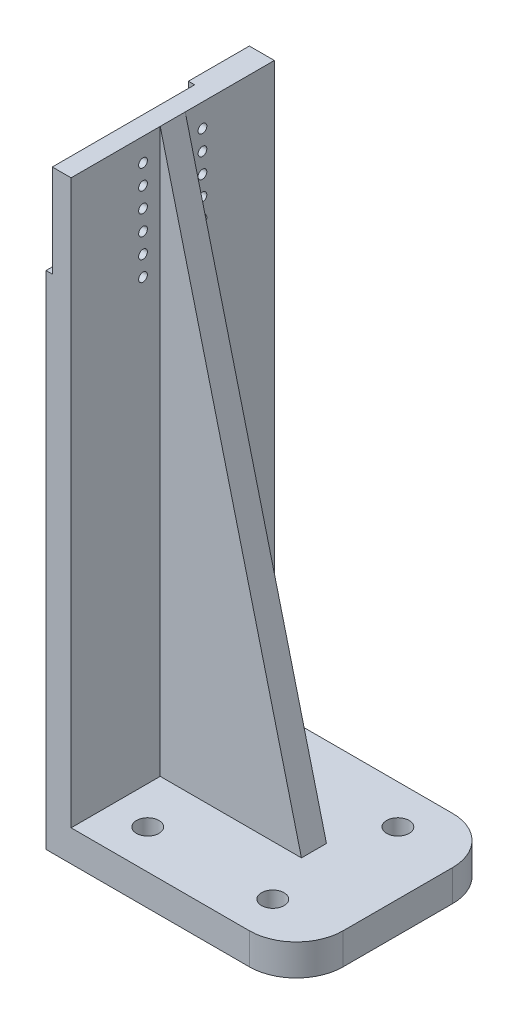
ISO-10303-21;
HEADER;
FILE_DESCRIPTION(('STEP AP214'),'2;1');
FILE_NAME('part.step','',(''),(''),'','','');
FILE_SCHEMA(('AUTOMOTIVE_DESIGN { 1 0 10303 214 1 1 1 1 }'));
ENDSEC;
DATA;
#1=APPLICATION_CONTEXT('core data for automotive mechanical design processes');
#2=APPLICATION_PROTOCOL_DEFINITION('international standard','automotive_design',2000,#1);
#3=PRODUCT_CONTEXT('',#1,'mechanical');
#4=PRODUCT('Part','Part','',(#3));
#5=PRODUCT_RELATED_PRODUCT_CATEGORY('part','',(#4));
#6=PRODUCT_DEFINITION_FORMATION('','',#4);
#7=PRODUCT_DEFINITION_CONTEXT('part definition',#1,'design');
#8=PRODUCT_DEFINITION('design','',#6,#7);
#9=PRODUCT_DEFINITION_SHAPE('','',#8);
#10=(LENGTH_UNIT() NAMED_UNIT(*) SI_UNIT(.MILLI.,.METRE.));
#11=(NAMED_UNIT(*) PLANE_ANGLE_UNIT() SI_UNIT($,.RADIAN.));
#12=(NAMED_UNIT(*) SI_UNIT($,.STERADIAN.) SOLID_ANGLE_UNIT());
#13=UNCERTAINTY_MEASURE_WITH_UNIT(LENGTH_MEASURE(1.E-05),#10,'distance_accuracy_value','');
#14=(GEOMETRIC_REPRESENTATION_CONTEXT(3) GLOBAL_UNCERTAINTY_ASSIGNED_CONTEXT((#13)) GLOBAL_UNIT_ASSIGNED_CONTEXT((#10,
#11,#12)) REPRESENTATION_CONTEXT('',''));
#15=CARTESIAN_POINT('',(0.,0.,0.));
#16=DIRECTION('',(0.,0.,1.));
#17=DIRECTION('',(1.,0.,0.));
#18=AXIS2_PLACEMENT_3D('',#15,#16,#17);
#19=CARTESIAN_POINT('',(-39.3740282952269,163.828996282528,32.5));
#20=DIRECTION('',(0.,-1.,0.));
#21=DIRECTION('',(0.,0.,-1.));
#22=AXIS2_PLACEMENT_3D('',#19,#20,#21);
#23=PLANE('',#22);
#24=DIRECTION('',(0.,0.,-1.));
#25=VECTOR('',#24,1.);
#26=CARTESIAN_POINT('',(-37.374028295227,163.828996282528,-13.));
#27=LINE('',#26,#25);
#28=CARTESIAN_POINT('',(-37.3740282952269,163.828996282528,32.5));
#29=VERTEX_POINT('',#28);
#30=CARTESIAN_POINT('',(-37.374028295227,163.828996282528,-13.));
#31=VERTEX_POINT('',#30);
#32=EDGE_CURVE('E178',#29,#31,#27,.T.);
#33=ORIENTED_EDGE('',*,*,#32,.F.);
#34=DIRECTION('',(-1.,0.,0.));
#35=VECTOR('',#34,1.);
#36=CARTESIAN_POINT('',(-39.3740282952269,163.828996282528,32.5));
#37=LINE('',#36,#35);
#38=CARTESIAN_POINT('',(-31.3740282952269,163.828996282528,32.5));
#39=VERTEX_POINT('',#38);
#40=EDGE_CURVE('E221',#39,#29,#37,.T.);
#41=ORIENTED_EDGE('',*,*,#40,.F.);
#42=DIRECTION('',(0.,0.,-1.));
#43=VECTOR('',#42,1.);
#44=CARTESIAN_POINT('',(-31.3740282952269,163.828996282528,32.5));
#45=LINE('',#44,#43);
#46=CARTESIAN_POINT('',(-31.3740282952269,163.828996282528,4.));
#47=VERTEX_POINT('',#46);
#48=EDGE_CURVE('E245',#39,#47,#45,.T.);
#49=ORIENTED_EDGE('',*,*,#48,.T.);
#50=DIRECTION('',(0.,0.,-1.));
#51=VECTOR('',#50,1.);
#52=CARTESIAN_POINT('',(-31.3740282952269,163.828996282528,4.));
#53=LINE('',#52,#51);
#54=CARTESIAN_POINT('',(-31.3740282952269,163.828996282528,-4.));
#55=VERTEX_POINT('',#54);
#56=EDGE_CURVE('E210',#47,#55,#53,.T.);
#57=ORIENTED_EDGE('',*,*,#56,.T.);
#58=CARTESIAN_POINT('',(-31.3740282952269,163.828996282528,-32.5));
#59=VERTEX_POINT('',#58);
#60=EDGE_CURVE('E234',#55,#59,#45,.T.);
#61=ORIENTED_EDGE('',*,*,#60,.T.);
#62=DIRECTION('',(-1.,0.,0.));
#63=VECTOR('',#62,1.);
#64=CARTESIAN_POINT('',(-39.3740282952269,163.828996282528,-32.5));
#65=LINE('',#64,#63);
#66=CARTESIAN_POINT('',(-39.3740282952269,163.828996282528,-32.5));
#67=VERTEX_POINT('',#66);
#68=EDGE_CURVE('E220',#59,#67,#65,.T.);
#69=ORIENTED_EDGE('',*,*,#68,.T.);
#70=DIRECTION('',(0.,0.,-1.));
#71=VECTOR('',#70,1.);
#72=CARTESIAN_POINT('',(-39.3740282952269,163.828996282528,32.5));
#73=LINE('',#72,#71);
#74=CARTESIAN_POINT('',(-39.374028295227,163.828996282528,-13.));
#75=VERTEX_POINT('',#74);
#76=EDGE_CURVE('E260',#75,#67,#73,.T.);
#77=ORIENTED_EDGE('',*,*,#76,.F.);
#78=DIRECTION('',(-1.,0.,0.));
#79=VECTOR('',#78,1.);
#80=CARTESIAN_POINT('',(-37.374028295227,163.828996282528,-13.));
#81=LINE('',#80,#79);
#82=EDGE_CURVE('E193',#31,#75,#81,.T.);
#83=ORIENTED_EDGE('',*,*,#82,.F.);
#84=EDGE_LOOP('',(#33,#41,#49,#57,#61,#69,#77,#83));
#85=FACE_BOUND('',#84,.T.);
#86=ADVANCED_FACE('F37',(#85),#23,.F.);
#87=CARTESIAN_POINT('',(-31.374028295227,-16.1710037174721,32.5));
#88=DIRECTION('',(-1.,0.,0.));
#89=DIRECTION('',(0.,-1.,0.));
#90=AXIS2_PLACEMENT_3D('',#87,#88,#89);
#91=PLANE('',#90);
#92=CARTESIAN_POINT('',(-31.3740282952269,143.818996282528,-9.50000000000005));
#93=DIRECTION('',(-1.,0.,0.));
#94=DIRECTION('',(0.,-1.,0.));
#95=AXIS2_PLACEMENT_3D('',#92,#93,#94);
#96=CIRCLE('',#95,1.40000000000001);
#97=CARTESIAN_POINT('',(-31.3740282952269,142.418996282528,-9.50000000000005));
#98=VERTEX_POINT('',#97);
#99=EDGE_CURVE('E189',#98,#98,#96,.T.);
#100=ORIENTED_EDGE('',*,*,#99,.T.);
#101=EDGE_LOOP('',(#100));
#102=FACE_BOUND('',#101,.T.);
#103=CARTESIAN_POINT('',(-31.3740282952269,150.148996282528,-9.50000000000007));
#104=DIRECTION('',(-1.,0.,0.));
#105=DIRECTION('',(0.,-1.,0.));
#106=AXIS2_PLACEMENT_3D('',#103,#104,#105);
#107=CIRCLE('',#106,1.40000000000001);
#108=CARTESIAN_POINT('',(-31.3740282952269,148.748996282528,-9.50000000000007));
#109=VERTEX_POINT('',#108);
#110=EDGE_CURVE('E388',#109,#109,#107,.T.);
#111=ORIENTED_EDGE('',*,*,#110,.T.);
#112=EDGE_LOOP('',(#111));
#113=FACE_BOUND('',#112,.T.);
#114=CARTESIAN_POINT('',(-31.3740282952269,131.158996282528,-9.50000000000001));
#115=DIRECTION('',(-1.,0.,0.));
#116=DIRECTION('',(0.,-1.,0.));
#117=AXIS2_PLACEMENT_3D('',#114,#115,#116);
#118=CIRCLE('',#117,1.40000000000001);
#119=CARTESIAN_POINT('',(-31.3740282952269,129.758996282528,-9.50000000000001));
#120=VERTEX_POINT('',#119);
#121=EDGE_CURVE('E382',#120,#120,#118,.T.);
#122=ORIENTED_EDGE('',*,*,#121,.T.);
#123=EDGE_LOOP('',(#122));
#124=FACE_BOUND('',#123,.T.);
#125=CARTESIAN_POINT('',(-31.3740282952269,137.488996282528,-9.50000000000003));
#126=DIRECTION('',(-1.,0.,0.));
#127=DIRECTION('',(0.,-1.,0.));
#128=AXIS2_PLACEMENT_3D('',#125,#126,#127);
#129=CIRCLE('',#128,1.40000000000001);
#130=CARTESIAN_POINT('',(-31.3740282952269,136.088996282528,-9.50000000000003));
#131=VERTEX_POINT('',#130);
#132=EDGE_CURVE('E376',#131,#131,#129,.T.);
#133=ORIENTED_EDGE('',*,*,#132,.T.);
#134=EDGE_LOOP('',(#133));
#135=FACE_BOUND('',#134,.T.);
#136=CARTESIAN_POINT('',(-31.3740282952269,124.828996282528,-9.49999999999999));
#137=DIRECTION('',(-1.,0.,0.));
#138=DIRECTION('',(0.,-1.,0.));
#139=AXIS2_PLACEMENT_3D('',#136,#137,#138);
#140=CIRCLE('',#139,1.4);
#141=CARTESIAN_POINT('',(-31.3740282952269,123.428996282528,-9.49999999999999));
#142=VERTEX_POINT('',#141);
#143=EDGE_CURVE('E370',#142,#142,#140,.T.);
#144=ORIENTED_EDGE('',*,*,#143,.T.);
#145=EDGE_LOOP('',(#144));
#146=FACE_BOUND('',#145,.T.);
#147=CARTESIAN_POINT('',(-31.3740282952269,156.478996282528,-9.5000000000001));
#148=DIRECTION('',(-1.,0.,0.));
#149=DIRECTION('',(0.,-1.,0.));
#150=AXIS2_PLACEMENT_3D('',#147,#148,#149);
#151=CIRCLE('',#150,1.40000000000001);
#152=CARTESIAN_POINT('',(-31.3740282952269,155.078996282528,-9.5000000000001));
#153=VERTEX_POINT('',#152);
#154=EDGE_CURVE('E364',#153,#153,#151,.T.);
#155=ORIENTED_EDGE('',*,*,#154,.T.);
#156=EDGE_LOOP('',(#155));
#157=FACE_BOUND('',#156,.T.);
#158=DIRECTION('',(0.,-1.,0.));
#159=VECTOR('',#158,1.);
#160=CARTESIAN_POINT('',(-31.374028295227,-16.1710037174721,-4.));
#161=LINE('',#160,#159);
#162=CARTESIAN_POINT('',(-31.374028295227,-16.1710037174721,-4.));
#163=VERTEX_POINT('',#162);
#164=EDGE_CURVE('E195',#55,#163,#161,.T.);
#165=ORIENTED_EDGE('',*,*,#164,.T.);
#166=DIRECTION('',(0.,0.,-1.));
#167=VECTOR('',#166,1.);
#168=CARTESIAN_POINT('',(-31.374028295227,-16.1710037174721,32.5));
#169=LINE('',#168,#167);
#170=CARTESIAN_POINT('',(-31.374028295227,-16.1710037174721,-32.5));
#171=VERTEX_POINT('',#170);
#172=EDGE_CURVE('E248',#163,#171,#169,.T.);
#173=ORIENTED_EDGE('',*,*,#172,.T.);
#174=DIRECTION('',(0.,1.,0.));
#175=VECTOR('',#174,1.);
#176=CARTESIAN_POINT('',(-31.374028295227,-16.1710037174721,-32.5));
#177=LINE('',#176,#175);
#178=EDGE_CURVE('E225',#171,#59,#177,.T.);
#179=ORIENTED_EDGE('',*,*,#178,.T.);
#180=ORIENTED_EDGE('',*,*,#60,.F.);
#181=EDGE_LOOP('',(#165,#173,#179,#180));
#182=FACE_BOUND('',#181,.T.);
#183=ADVANCED_FACE('F302',(#102,#113,#124,#135,#146,#157,#182),#91,.F.);
#184=CARTESIAN_POINT('',(-39.3740282952269,163.828996282528,32.5));
#185=DIRECTION('',(1.,0.,0.));
#186=DIRECTION('',(0.,1.,0.));
#187=AXIS2_PLACEMENT_3D('',#184,#185,#186);
#188=PLANE('',#187);
#189=DIRECTION('',(0.,-1.,0.));
#190=VECTOR('',#189,1.);
#191=CARTESIAN_POINT('',(-39.3740282952269,163.828996282528,32.5));
#192=LINE('',#191,#190);
#193=CARTESIAN_POINT('',(-39.3740282952269,134.158996282528,32.5));
#194=VERTEX_POINT('',#193);
#195=CARTESIAN_POINT('',(-39.3740282952269,-26.1710037174721,32.5));
#196=VERTEX_POINT('',#195);
#197=EDGE_CURVE('E224',#194,#196,#192,.T.);
#198=ORIENTED_EDGE('',*,*,#197,.F.);
#199=DIRECTION('',(0.,0.,1.));
#200=VECTOR('',#199,1.);
#201=CARTESIAN_POINT('',(-39.3740282952269,134.158996282528,0.));
#202=LINE('',#201,#200);
#203=CARTESIAN_POINT('',(-39.3740282952269,134.158996282528,13.));
#204=VERTEX_POINT('',#203);
#205=EDGE_CURVE('E162',#204,#194,#202,.T.);
#206=ORIENTED_EDGE('',*,*,#205,.F.);
#207=DIRECTION('',(0.,1.,0.));
#208=VECTOR('',#207,1.);
#209=CARTESIAN_POINT('',(-39.374028295227,163.828996282528,13.));
#210=LINE('',#209,#208);
#211=CARTESIAN_POINT('',(-39.3740282952269,121.828996282528,13.));
#212=VERTEX_POINT('',#211);
#213=EDGE_CURVE('E171',#212,#204,#210,.T.);
#214=ORIENTED_EDGE('',*,*,#213,.F.);
#215=DIRECTION('',(0.,0.,1.));
#216=VECTOR('',#215,1.);
#217=CARTESIAN_POINT('',(-39.3740282952269,121.828996282528,-13.));
#218=LINE('',#217,#216);
#219=CARTESIAN_POINT('',(-39.3740282952269,121.828996282528,-13.));
#220=VERTEX_POINT('',#219);
#221=EDGE_CURVE('E188',#220,#212,#218,.T.);
#222=ORIENTED_EDGE('',*,*,#221,.F.);
#223=DIRECTION('',(0.,-1.,0.));
#224=VECTOR('',#223,1.);
#225=CARTESIAN_POINT('',(-39.374028295227,163.828996282528,-13.));
#226=LINE('',#225,#224);
#227=EDGE_CURVE('E186',#75,#220,#226,.T.);
#228=ORIENTED_EDGE('',*,*,#227,.F.);
#229=ORIENTED_EDGE('',*,*,#76,.T.);
#230=DIRECTION('',(0.,-1.,0.));
#231=VECTOR('',#230,1.);
#232=CARTESIAN_POINT('',(-39.3740282952269,163.828996282528,-32.5));
#233=LINE('',#232,#231);
#234=CARTESIAN_POINT('',(-39.3740282952269,-26.1710037174721,-32.5));
#235=VERTEX_POINT('',#234);
#236=EDGE_CURVE('E237',#67,#235,#233,.T.);
#237=ORIENTED_EDGE('',*,*,#236,.T.);
#238=DIRECTION('',(0.,0.,-1.));
#239=VECTOR('',#238,1.);
#240=CARTESIAN_POINT('',(-39.3740282952269,-26.1710037174721,32.5));
#241=LINE('',#240,#239);
#242=EDGE_CURVE('E257',#196,#235,#241,.T.);
#243=ORIENTED_EDGE('',*,*,#242,.F.);
#244=EDGE_LOOP('',(#198,#206,#214,#222,#228,#229,#237,#243));
#245=FACE_BOUND('',#244,.T.);
#246=ADVANCED_FACE('F401',(#245),#188,.F.);
#247=CARTESIAN_POINT('',(-39.3740282952269,-26.1710037174721,32.5));
#248=DIRECTION('',(0.,1.,0.));
#249=DIRECTION('',(0.,0.,1.));
#250=AXIS2_PLACEMENT_3D('',#247,#248,#249);
#251=PLANE('',#250);
#252=CARTESIAN_POINT('',(20.6259717047731,-26.1710037174721,20.));
#253=DIRECTION('',(0.,1.,0.));
#254=DIRECTION('',(-1.,0.,0.));
#255=AXIS2_PLACEMENT_3D('',#252,#253,#254);
#256=CIRCLE('',#255,3.6);
#257=CARTESIAN_POINT('',(17.0259717047731,-26.1710037174721,20.));
#258=VERTEX_POINT('',#257);
#259=EDGE_CURVE('E410',#258,#258,#256,.T.);
#260=ORIENTED_EDGE('',*,*,#259,.T.);
#261=EDGE_LOOP('',(#260));
#262=FACE_BOUND('',#261,.T.);
#263=CARTESIAN_POINT('',(-19.3740282952269,-26.1710037174721,-20.));
#264=DIRECTION('',(0.,1.,0.));
#265=DIRECTION('',(-1.,0.,0.));
#266=AXIS2_PLACEMENT_3D('',#263,#264,#265);
#267=CIRCLE('',#266,3.6);
#268=CARTESIAN_POINT('',(-22.9740282952269,-26.1710037174721,-20.));
#269=VERTEX_POINT('',#268);
#270=EDGE_CURVE('E416',#269,#269,#267,.T.);
#271=ORIENTED_EDGE('',*,*,#270,.T.);
#272=EDGE_LOOP('',(#271));
#273=FACE_BOUND('',#272,.T.);
#274=CARTESIAN_POINT('',(-19.3740282952269,-26.1710037174721,20.));
#275=DIRECTION('',(0.,1.,0.));
#276=DIRECTION('',(-1.,0.,0.));
#277=AXIS2_PLACEMENT_3D('',#274,#275,#276);
#278=CIRCLE('',#277,3.6);
#279=CARTESIAN_POINT('',(-22.9740282952269,-26.1710037174721,20.));
#280=VERTEX_POINT('',#279);
#281=EDGE_CURVE('E417',#280,#280,#278,.T.);
#282=ORIENTED_EDGE('',*,*,#281,.T.);
#283=EDGE_LOOP('',(#282));
#284=FACE_BOUND('',#283,.T.);
#285=CARTESIAN_POINT('',(20.6259717047731,-26.1710037174721,-20.));
#286=DIRECTION('',(0.,1.,0.));
#287=DIRECTION('',(-1.,0.,0.));
#288=AXIS2_PLACEMENT_3D('',#285,#286,#287);
#289=CIRCLE('',#288,3.6);
#290=CARTESIAN_POINT('',(17.0259717047731,-26.1710037174721,-20.));
#291=VERTEX_POINT('',#290);
#292=EDGE_CURVE('E403',#291,#291,#289,.T.);
#293=ORIENTED_EDGE('',*,*,#292,.T.);
#294=EDGE_LOOP('',(#293));
#295=FACE_BOUND('',#294,.T.);
#296=DIRECTION('',(0.,0.,-1.));
#297=VECTOR('',#296,1.);
#298=CARTESIAN_POINT('',(40.6259717047731,-26.1710037174721,32.5));
#299=LINE('',#298,#297);
#300=CARTESIAN_POINT('',(40.6259717047731,-26.1710037174721,17.5));
#301=VERTEX_POINT('',#300);
#302=CARTESIAN_POINT('',(40.6259717047731,-26.1710037174721,-17.5));
#303=VERTEX_POINT('',#302);
#304=EDGE_CURVE('E255',#301,#303,#299,.T.);
#305=ORIENTED_EDGE('',*,*,#304,.F.);
#306=CARTESIAN_POINT('',(25.6259717047731,-26.1710037174721,17.5));
#307=DIRECTION('',(0.,1.,0.));
#308=DIRECTION('',(0.,0.,1.));
#309=AXIS2_PLACEMENT_3D('',#306,#307,#308);
#310=CIRCLE('',#309,15.);
#311=CARTESIAN_POINT('',(25.6259717047731,-26.1710037174721,32.5));
#312=VERTEX_POINT('',#311);
#313=EDGE_CURVE('E45',#301,#312,#310,.F.);
#314=ORIENTED_EDGE('',*,*,#313,.T.);
#315=DIRECTION('',(1.,0.,0.));
#316=VECTOR('',#315,1.);
#317=CARTESIAN_POINT('',(-39.3740282952269,-26.1710037174721,32.5));
#318=LINE('',#317,#316);
#319=EDGE_CURVE('E227',#196,#312,#318,.T.);
#320=ORIENTED_EDGE('',*,*,#319,.F.);
#321=ORIENTED_EDGE('',*,*,#242,.T.);
#322=DIRECTION('',(1.,0.,0.));
#323=VECTOR('',#322,1.);
#324=CARTESIAN_POINT('',(-39.3740282952269,-26.1710037174721,-32.5));
#325=LINE('',#324,#323);
#326=CARTESIAN_POINT('',(25.6259717047731,-26.1710037174721,-32.5));
#327=VERTEX_POINT('',#326);
#328=EDGE_CURVE('E239',#235,#327,#325,.T.);
#329=ORIENTED_EDGE('',*,*,#328,.T.);
#330=CARTESIAN_POINT('',(25.6259717047731,-26.1710037174721,-17.5));
#331=DIRECTION('',(0.,1.,0.));
#332=DIRECTION('',(0.,0.,1.));
#333=AXIS2_PLACEMENT_3D('',#330,#331,#332);
#334=CIRCLE('',#333,15.);
#335=EDGE_CURVE('E57',#327,#303,#334,.F.);
#336=ORIENTED_EDGE('',*,*,#335,.T.);
#337=EDGE_LOOP('',(#305,#314,#320,#321,#329,#336));
#338=FACE_BOUND('',#337,.T.);
#339=ADVANCED_FACE('F276',(#262,#273,#284,#295,#338),#251,.F.);
#340=CARTESIAN_POINT('',(40.6259717047731,-26.1710037174721,32.5));
#341=DIRECTION('',(-1.,0.,0.));
#342=DIRECTION('',(0.,0.,1.));
#343=AXIS2_PLACEMENT_3D('',#340,#341,#342);
#344=PLANE('',#343);
#345=DIRECTION('',(0.,0.,-1.));
#346=VECTOR('',#345,1.);
#347=CARTESIAN_POINT('',(40.6259717047731,-16.1710037174721,32.5));
#348=LINE('',#347,#346);
#349=CARTESIAN_POINT('',(40.6259717047731,-16.1710037174721,17.5));
#350=VERTEX_POINT('',#349);
#351=CARTESIAN_POINT('',(40.6259717047731,-16.1710037174721,-17.5));
#352=VERTEX_POINT('',#351);
#353=EDGE_CURVE('E252',#350,#352,#348,.T.);
#354=ORIENTED_EDGE('',*,*,#353,.F.);
#355=DIRECTION('',(0.,1.,0.));
#356=VECTOR('',#355,1.);
#357=CARTESIAN_POINT('',(40.6259717047731,-26.1710037174721,17.5));
#358=LINE('',#357,#356);
#359=EDGE_CURVE('E272',#350,#301,#358,.F.);
#360=ORIENTED_EDGE('',*,*,#359,.T.);
#361=ORIENTED_EDGE('',*,*,#304,.T.);
#362=DIRECTION('',(0.,1.,0.));
#363=VECTOR('',#362,1.);
#364=CARTESIAN_POINT('',(40.6259717047731,-26.1710037174721,-17.5));
#365=LINE('',#364,#363);
#366=EDGE_CURVE('E269',#303,#352,#365,.T.);
#367=ORIENTED_EDGE('',*,*,#366,.T.);
#368=EDGE_LOOP('',(#354,#360,#361,#367));
#369=FACE_BOUND('',#368,.T.);
#370=ADVANCED_FACE('F291',(#369),#344,.F.);
#371=CARTESIAN_POINT('',(40.6259717047731,-16.1710037174721,32.5));
#372=DIRECTION('',(0.,-1.,0.));
#373=DIRECTION('',(1.,0.,0.));
#374=AXIS2_PLACEMENT_3D('',#371,#372,#373);
#375=PLANE('',#374);
#376=CARTESIAN_POINT('',(20.6259717047731,-16.1710037174721,20.));
#377=DIRECTION('',(0.,1.,0.));
#378=DIRECTION('',(-1.,0.,0.));
#379=AXIS2_PLACEMENT_3D('',#376,#377,#378);
#380=CIRCLE('',#379,3.6);
#381=CARTESIAN_POINT('',(17.0259717047731,-16.1710037174721,20.));
#382=VERTEX_POINT('',#381);
#383=EDGE_CURVE('E420',#382,#382,#380,.T.);
#384=ORIENTED_EDGE('',*,*,#383,.F.);
#385=EDGE_LOOP('',(#384));
#386=FACE_BOUND('',#385,.T.);
#387=CARTESIAN_POINT('',(-19.3740282952269,-16.1710037174721,-20.));
#388=DIRECTION('',(0.,1.,0.));
#389=DIRECTION('',(-1.,0.,0.));
#390=AXIS2_PLACEMENT_3D('',#387,#388,#389);
#391=CIRCLE('',#390,3.6);
#392=CARTESIAN_POINT('',(-22.9740282952269,-16.1710037174721,-20.));
#393=VERTEX_POINT('',#392);
#394=EDGE_CURVE('E413',#393,#393,#391,.T.);
#395=ORIENTED_EDGE('',*,*,#394,.F.);
#396=EDGE_LOOP('',(#395));
#397=FACE_BOUND('',#396,.T.);
#398=CARTESIAN_POINT('',(-19.3740282952269,-16.1710037174721,20.));
#399=DIRECTION('',(0.,1.,0.));
#400=DIRECTION('',(-1.,0.,0.));
#401=AXIS2_PLACEMENT_3D('',#398,#399,#400);
#402=CIRCLE('',#401,3.6);
#403=CARTESIAN_POINT('',(-22.9740282952269,-16.1710037174721,20.));
#404=VERTEX_POINT('',#403);
#405=EDGE_CURVE('E425',#404,#404,#402,.T.);
#406=ORIENTED_EDGE('',*,*,#405,.F.);
#407=EDGE_LOOP('',(#406));
#408=FACE_BOUND('',#407,.T.);
#409=CARTESIAN_POINT('',(20.6259717047731,-16.1710037174721,-20.));
#410=DIRECTION('',(0.,1.,0.));
#411=DIRECTION('',(-1.,0.,0.));
#412=AXIS2_PLACEMENT_3D('',#409,#410,#411);
#413=CIRCLE('',#412,3.6);
#414=CARTESIAN_POINT('',(17.0259717047731,-16.1710037174721,-20.));
#415=VERTEX_POINT('',#414);
#416=EDGE_CURVE('E405',#415,#415,#413,.T.);
#417=ORIENTED_EDGE('',*,*,#416,.F.);
#418=EDGE_LOOP('',(#417));
#419=FACE_BOUND('',#418,.T.);
#420=DIRECTION('',(-1.,0.,0.));
#421=VECTOR('',#420,1.);
#422=CARTESIAN_POINT('',(40.6259717047731,-16.1710037174721,32.5));
#423=LINE('',#422,#421);
#424=CARTESIAN_POINT('',(25.6259717047731,-16.1710037174721,32.5));
#425=VERTEX_POINT('',#424);
#426=CARTESIAN_POINT('',(-31.374028295227,-16.1710037174721,32.5));
#427=VERTEX_POINT('',#426);
#428=EDGE_CURVE('E230',#425,#427,#423,.T.);
#429=ORIENTED_EDGE('',*,*,#428,.F.);
#430=CARTESIAN_POINT('',(25.6259717047731,-16.1710037174721,17.5));
#431=DIRECTION('',(0.,-1.,0.));
#432=DIRECTION('',(1.,0.,0.));
#433=AXIS2_PLACEMENT_3D('',#430,#431,#432);
#434=CIRCLE('',#433,15.);
#435=EDGE_CURVE('E267',#425,#350,#434,.F.);
#436=ORIENTED_EDGE('',*,*,#435,.T.);
#437=ORIENTED_EDGE('',*,*,#353,.T.);
#438=CARTESIAN_POINT('',(25.6259717047731,-16.1710037174721,-17.5));
#439=DIRECTION('',(0.,-1.,0.));
#440=DIRECTION('',(1.,0.,0.));
#441=AXIS2_PLACEMENT_3D('',#438,#439,#440);
#442=CIRCLE('',#441,15.);
#443=CARTESIAN_POINT('',(25.6259717047731,-16.1710037174721,-32.5));
#444=VERTEX_POINT('',#443);
#445=EDGE_CURVE('E265',#352,#444,#442,.F.);
#446=ORIENTED_EDGE('',*,*,#445,.T.);
#447=DIRECTION('',(-1.,0.,0.));
#448=VECTOR('',#447,1.);
#449=CARTESIAN_POINT('',(40.6259717047731,-16.1710037174721,-32.5));
#450=LINE('',#449,#448);
#451=EDGE_CURVE('E241',#444,#171,#450,.T.);
#452=ORIENTED_EDGE('',*,*,#451,.T.);
#453=ORIENTED_EDGE('',*,*,#172,.F.);
#454=DIRECTION('',(1.,0.,0.));
#455=VECTOR('',#454,1.);
#456=CARTESIAN_POINT('',(13.7849518672291,-16.1710037174721,-4.));
#457=LINE('',#456,#455);
#458=CARTESIAN_POINT('',(13.7849518672291,-16.1710037174721,-4.));
#459=VERTEX_POINT('',#458);
#460=EDGE_CURVE('E212',#163,#459,#457,.T.);
#461=ORIENTED_EDGE('',*,*,#460,.T.);
#462=DIRECTION('',(0.,0.,-1.));
#463=VECTOR('',#462,1.);
#464=CARTESIAN_POINT('',(13.7849518672291,-16.1710037174721,4.));
#465=LINE('',#464,#463);
#466=CARTESIAN_POINT('',(13.7849518672291,-16.1710037174721,4.));
#467=VERTEX_POINT('',#466);
#468=EDGE_CURVE('E217',#467,#459,#465,.T.);
#469=ORIENTED_EDGE('',*,*,#468,.F.);
#470=DIRECTION('',(1.,0.,0.));
#471=VECTOR('',#470,1.);
#472=CARTESIAN_POINT('',(13.7849518672291,-16.1710037174721,4.));
#473=LINE('',#472,#471);
#474=CARTESIAN_POINT('',(-31.374028295227,-16.1710037174721,4.));
#475=VERTEX_POINT('',#474);
#476=EDGE_CURVE('E203',#475,#467,#473,.T.);
#477=ORIENTED_EDGE('',*,*,#476,.F.);
#478=EDGE_CURVE('E249',#427,#475,#169,.T.);
#479=ORIENTED_EDGE('',*,*,#478,.F.);
#480=EDGE_LOOP('',(#429,#436,#437,#446,#452,#453,#461,#469,#477,#479));
#481=FACE_BOUND('',#480,.T.);
#482=ADVANCED_FACE('F288',(#386,#397,#408,#419,#481),#375,.F.);
#483=CARTESIAN_POINT('',(-31.3740282952269,150.148996282528,9.49999999999993));
#484=DIRECTION('',(-1.,0.,0.));
#485=DIRECTION('',(0.,-1.,0.));
#486=AXIS2_PLACEMENT_3D('',#483,#484,#485);
#487=CIRCLE('',#486,1.40000000000001);
#488=CARTESIAN_POINT('',(-31.3740282952269,148.748996282528,9.49999999999993));
#489=VERTEX_POINT('',#488);
#490=EDGE_CURVE('E391',#489,#489,#487,.T.);
#491=ORIENTED_EDGE('',*,*,#490,.T.);
#492=EDGE_LOOP('',(#491));
#493=FACE_BOUND('',#492,.T.);
#494=CARTESIAN_POINT('',(-31.3740282952269,156.478996282528,9.4999999999999));
#495=DIRECTION('',(-1.,0.,0.));
#496=DIRECTION('',(0.,-1.,0.));
#497=AXIS2_PLACEMENT_3D('',#494,#495,#496);
#498=CIRCLE('',#497,1.40000000000001);
#499=CARTESIAN_POINT('',(-31.3740282952269,155.078996282528,9.4999999999999));
#500=VERTEX_POINT('',#499);
#501=EDGE_CURVE('E385',#500,#500,#498,.T.);
#502=ORIENTED_EDGE('',*,*,#501,.T.);
#503=EDGE_LOOP('',(#502));
#504=FACE_BOUND('',#503,.T.);
#505=CARTESIAN_POINT('',(-31.3740282952269,137.488996282528,9.49999999999997));
#506=DIRECTION('',(-1.,0.,0.));
#507=DIRECTION('',(0.,-1.,0.));
#508=AXIS2_PLACEMENT_3D('',#505,#506,#507);
#509=CIRCLE('',#508,1.4);
#510=CARTESIAN_POINT('',(-31.3740282952269,136.088996282528,9.49999999999997));
#511=VERTEX_POINT('',#510);
#512=EDGE_CURVE('E379',#511,#511,#509,.T.);
#513=ORIENTED_EDGE('',*,*,#512,.T.);
#514=EDGE_LOOP('',(#513));
#515=FACE_BOUND('',#514,.T.);
#516=CARTESIAN_POINT('',(-31.3740282952269,143.818996282528,9.49999999999995));
#517=DIRECTION('',(-1.,0.,0.));
#518=DIRECTION('',(0.,-1.,0.));
#519=AXIS2_PLACEMENT_3D('',#516,#517,#518);
#520=CIRCLE('',#519,1.4);
#521=CARTESIAN_POINT('',(-31.3740282952269,142.418996282528,9.49999999999995));
#522=VERTEX_POINT('',#521);
#523=EDGE_CURVE('E373',#522,#522,#520,.T.);
#524=ORIENTED_EDGE('',*,*,#523,.T.);
#525=EDGE_LOOP('',(#524));
#526=FACE_BOUND('',#525,.T.);
#527=CARTESIAN_POINT('',(-31.3740282952269,124.828996282528,9.50000000000001));
#528=DIRECTION('',(-1.,0.,0.));
#529=DIRECTION('',(0.,-1.,0.));
#530=AXIS2_PLACEMENT_3D('',#527,#528,#529);
#531=CIRCLE('',#530,1.4);
#532=CARTESIAN_POINT('',(-31.3740282952269,123.428996282528,9.50000000000001));
#533=VERTEX_POINT('',#532);
#534=EDGE_CURVE('E367',#533,#533,#531,.T.);
#535=ORIENTED_EDGE('',*,*,#534,.T.);
#536=EDGE_LOOP('',(#535));
#537=FACE_BOUND('',#536,.T.);
#538=CARTESIAN_POINT('',(-31.3740282952269,131.158996282528,9.49999999999999));
#539=DIRECTION('',(-1.,0.,0.));
#540=DIRECTION('',(0.,-1.,0.));
#541=AXIS2_PLACEMENT_3D('',#538,#539,#540);
#542=CIRCLE('',#541,1.4);
#543=CARTESIAN_POINT('',(-31.3740282952269,129.758996282528,9.49999999999999));
#544=VERTEX_POINT('',#543);
#545=EDGE_CURVE('E361',#544,#544,#542,.T.);
#546=ORIENTED_EDGE('',*,*,#545,.T.);
#547=EDGE_LOOP('',(#546));
#548=FACE_BOUND('',#547,.T.);
#549=ORIENTED_EDGE('',*,*,#478,.T.);
#550=DIRECTION('',(0.,-1.,0.));
#551=VECTOR('',#550,1.);
#552=CARTESIAN_POINT('',(-31.374028295227,-16.1710037174721,4.));
#553=LINE('',#552,#551);
#554=EDGE_CURVE('E200',#47,#475,#553,.T.);
#555=ORIENTED_EDGE('',*,*,#554,.F.);
#556=ORIENTED_EDGE('',*,*,#48,.F.);
#557=DIRECTION('',(0.,1.,0.));
#558=VECTOR('',#557,1.);
#559=CARTESIAN_POINT('',(-31.374028295227,-16.1710037174721,32.5));
#560=LINE('',#559,#558);
#561=EDGE_CURVE('E232',#427,#39,#560,.T.);
#562=ORIENTED_EDGE('',*,*,#561,.F.);
#563=EDGE_LOOP('',(#549,#555,#556,#562));
#564=FACE_BOUND('',#563,.T.);
#565=ADVANCED_FACE('F316',(#493,#504,#515,#526,#537,#548,#564),#91,.F.);
#566=CARTESIAN_POINT('',(0.,0.,32.5));
#567=DIRECTION('',(0.,0.,1.));
#568=DIRECTION('',(1.,0.,0.));
#569=AXIS2_PLACEMENT_3D('',#566,#567,#568);
#570=PLANE('',#569);
#571=ORIENTED_EDGE('',*,*,#319,.T.);
#572=DIRECTION('',(0.,1.,0.));
#573=VECTOR('',#572,1.);
#574=CARTESIAN_POINT('',(25.6259717047731,-16.1710037174721,32.5));
#575=LINE('',#574,#573);
#576=EDGE_CURVE('E262',#312,#425,#575,.T.);
#577=ORIENTED_EDGE('',*,*,#576,.T.);
#578=ORIENTED_EDGE('',*,*,#428,.T.);
#579=ORIENTED_EDGE('',*,*,#561,.T.);
#580=ORIENTED_EDGE('',*,*,#40,.T.);
#581=DIRECTION('',(0.,-1.,0.));
#582=VECTOR('',#581,1.);
#583=CARTESIAN_POINT('',(-37.3740282952269,0.,32.5));
#584=LINE('',#583,#582);
#585=CARTESIAN_POINT('',(-37.3740282952269,134.158996282528,32.5));
#586=VERTEX_POINT('',#585);
#587=EDGE_CURVE('E161',#29,#586,#584,.T.);
#588=ORIENTED_EDGE('',*,*,#587,.T.);
#589=DIRECTION('',(1.,0.,0.));
#590=VECTOR('',#589,1.);
#591=CARTESIAN_POINT('',(0.,134.158996282528,32.5));
#592=LINE('',#591,#590);
#593=EDGE_CURVE('E156',#194,#586,#592,.T.);
#594=ORIENTED_EDGE('',*,*,#593,.F.);
#595=ORIENTED_EDGE('',*,*,#197,.T.);
#596=EDGE_LOOP('',(#571,#577,#578,#579,#580,#588,#594,#595));
#597=FACE_BOUND('',#596,.T.);
#598=ADVANCED_FACE('F281',(#597),#570,.T.);
#599=CARTESIAN_POINT('',(0.,0.,-32.5));
#600=DIRECTION('',(0.,0.,1.));
#601=DIRECTION('',(1.,0.,0.));
#602=AXIS2_PLACEMENT_3D('',#599,#600,#601);
#603=PLANE('',#602);
#604=ORIENTED_EDGE('',*,*,#451,.F.);
#605=DIRECTION('',(0.,1.,0.));
#606=VECTOR('',#605,1.);
#607=CARTESIAN_POINT('',(25.6259717047731,0.,-32.5));
#608=LINE('',#607,#606);
#609=EDGE_CURVE('E11',#444,#327,#608,.F.);
#610=ORIENTED_EDGE('',*,*,#609,.T.);
#611=ORIENTED_EDGE('',*,*,#328,.F.);
#612=ORIENTED_EDGE('',*,*,#236,.F.);
#613=ORIENTED_EDGE('',*,*,#68,.F.);
#614=ORIENTED_EDGE('',*,*,#178,.F.);
#615=EDGE_LOOP('',(#604,#610,#611,#612,#613,#614));
#616=FACE_BOUND('',#615,.T.);
#617=ADVANCED_FACE('F297',(#616),#603,.F.);
#618=CARTESIAN_POINT('',(-31.3740282952269,163.828996282528,4.));
#619=DIRECTION('',(-0.969940594752515,-0.243341822651054,0.));
#620=DIRECTION('',(0.243341822651054,-0.969940594752515,0.));
#621=AXIS2_PLACEMENT_3D('',#618,#619,#620);
#622=PLANE('',#621);
#623=DIRECTION('',(-0.243341822651054,0.969940594752515,0.));
#624=VECTOR('',#623,1.);
#625=CARTESIAN_POINT('',(-31.3740282952269,163.828996282528,-4.));
#626=LINE('',#625,#624);
#627=EDGE_CURVE('E204',#459,#55,#626,.T.);
#628=ORIENTED_EDGE('',*,*,#627,.T.);
#629=ORIENTED_EDGE('',*,*,#56,.F.);
#630=DIRECTION('',(-0.243341822651054,0.969940594752515,0.));
#631=VECTOR('',#630,1.);
#632=CARTESIAN_POINT('',(-31.3740282952269,163.828996282528,4.));
#633=LINE('',#632,#631);
#634=EDGE_CURVE('E207',#467,#47,#633,.T.);
#635=ORIENTED_EDGE('',*,*,#634,.F.);
#636=ORIENTED_EDGE('',*,*,#468,.T.);
#637=EDGE_LOOP('',(#628,#629,#635,#636));
#638=FACE_BOUND('',#637,.T.);
#639=ADVANCED_FACE('F310',(#638),#622,.F.);
#640=CARTESIAN_POINT('',(0.,0.,4.));
#641=DIRECTION('',(0.,0.,1.));
#642=DIRECTION('',(1.,0.,0.));
#643=AXIS2_PLACEMENT_3D('',#640,#641,#642);
#644=PLANE('',#643);
#645=ORIENTED_EDGE('',*,*,#554,.T.);
#646=ORIENTED_EDGE('',*,*,#476,.T.);
#647=ORIENTED_EDGE('',*,*,#634,.T.);
#648=EDGE_LOOP('',(#645,#646,#647));
#649=FACE_BOUND('',#648,.T.);
#650=ADVANCED_FACE('F313',(#649),#644,.T.);
#651=CARTESIAN_POINT('',(0.,0.,-4.));
#652=DIRECTION('',(0.,0.,1.));
#653=DIRECTION('',(1.,0.,0.));
#654=AXIS2_PLACEMENT_3D('',#651,#652,#653);
#655=PLANE('',#654);
#656=ORIENTED_EDGE('',*,*,#164,.F.);
#657=ORIENTED_EDGE('',*,*,#627,.F.);
#658=ORIENTED_EDGE('',*,*,#460,.F.);
#659=EDGE_LOOP('',(#656,#657,#658));
#660=FACE_BOUND('',#659,.T.);
#661=ADVANCED_FACE('F307',(#660),#655,.F.);
#662=CARTESIAN_POINT('',(-37.374028295227,163.828996282528,-13.));
#663=DIRECTION('',(0.,0.,-1.));
#664=DIRECTION('',(0.,1.,0.));
#665=AXIS2_PLACEMENT_3D('',#662,#663,#664);
#666=PLANE('',#665);
#667=ORIENTED_EDGE('',*,*,#227,.T.);
#668=DIRECTION('',(-1.,0.,0.));
#669=VECTOR('',#668,1.);
#670=CARTESIAN_POINT('',(-37.3740282952269,121.828996282528,-13.));
#671=LINE('',#670,#669);
#672=CARTESIAN_POINT('',(-37.3740282952269,121.828996282528,-13.));
#673=VERTEX_POINT('',#672);
#674=EDGE_CURVE('E180',#673,#220,#671,.T.);
#675=ORIENTED_EDGE('',*,*,#674,.F.);
#676=DIRECTION('',(0.,-1.,0.));
#677=VECTOR('',#676,1.);
#678=CARTESIAN_POINT('',(-37.374028295227,163.828996282528,-13.));
#679=LINE('',#678,#677);
#680=EDGE_CURVE('E182',#31,#673,#679,.T.);
#681=ORIENTED_EDGE('',*,*,#680,.F.);
#682=ORIENTED_EDGE('',*,*,#82,.T.);
#683=EDGE_LOOP('',(#667,#675,#681,#682));
#684=FACE_BOUND('',#683,.T.);
#685=ADVANCED_FACE('F397',(#684),#666,.F.);
#686=CARTESIAN_POINT('',(-37.374028295227,163.828996282528,13.));
#687=DIRECTION('',(0.,0.,1.));
#688=DIRECTION('',(0.,-1.,0.));
#689=AXIS2_PLACEMENT_3D('',#686,#687,#688);
#690=PLANE('',#689);
#691=ORIENTED_EDGE('',*,*,#213,.T.);
#692=DIRECTION('',(1.,0.,0.));
#693=VECTOR('',#692,1.);
#694=CARTESIAN_POINT('',(-37.374028295227,134.158996282528,13.));
#695=LINE('',#694,#693);
#696=CARTESIAN_POINT('',(-37.3740282952269,134.158996282528,13.));
#697=VERTEX_POINT('',#696);
#698=EDGE_CURVE('E153',#204,#697,#695,.T.);
#699=ORIENTED_EDGE('',*,*,#698,.T.);
#700=DIRECTION('',(0.,1.,0.));
#701=VECTOR('',#700,1.);
#702=CARTESIAN_POINT('',(-37.374028295227,163.828996282528,13.));
#703=LINE('',#702,#701);
#704=CARTESIAN_POINT('',(-37.3740282952269,121.828996282528,13.));
#705=VERTEX_POINT('',#704);
#706=EDGE_CURVE('E168',#705,#697,#703,.T.);
#707=ORIENTED_EDGE('',*,*,#706,.F.);
#708=DIRECTION('',(-1.,0.,0.));
#709=VECTOR('',#708,1.);
#710=CARTESIAN_POINT('',(-37.3740282952269,121.828996282528,13.));
#711=LINE('',#710,#709);
#712=EDGE_CURVE('E196',#705,#212,#711,.T.);
#713=ORIENTED_EDGE('',*,*,#712,.T.);
#714=EDGE_LOOP('',(#691,#699,#707,#713));
#715=FACE_BOUND('',#714,.T.);
#716=ADVANCED_FACE('F167',(#715),#690,.F.);
#717=CARTESIAN_POINT('',(-37.3740282952269,121.828996282528,-13.));
#718=DIRECTION('',(0.,-1.,0.));
#719=DIRECTION('',(1.,0.,0.));
#720=AXIS2_PLACEMENT_3D('',#717,#718,#719);
#721=PLANE('',#720);
#722=ORIENTED_EDGE('',*,*,#221,.T.);
#723=ORIENTED_EDGE('',*,*,#712,.F.);
#724=DIRECTION('',(0.,0.,1.));
#725=VECTOR('',#724,1.);
#726=CARTESIAN_POINT('',(-37.3740282952269,121.828996282528,-13.));
#727=LINE('',#726,#725);
#728=EDGE_CURVE('E177',#673,#705,#727,.T.);
#729=ORIENTED_EDGE('',*,*,#728,.F.);
#730=ORIENTED_EDGE('',*,*,#674,.T.);
#731=EDGE_LOOP('',(#722,#723,#729,#730));
#732=FACE_BOUND('',#731,.T.);
#733=ADVANCED_FACE('F506',(#732),#721,.F.);
#734=CARTESIAN_POINT('',(-37.3740282952269,0.,0.));
#735=DIRECTION('',(-1.,0.,0.));
#736=DIRECTION('',(0.,-1.,0.));
#737=AXIS2_PLACEMENT_3D('',#734,#735,#736);
#738=PLANE('',#737);
#739=ORIENTED_EDGE('',*,*,#706,.T.);
#740=DIRECTION('',(0.,0.,1.));
#741=VECTOR('',#740,1.);
#742=CARTESIAN_POINT('',(-37.3740282952269,134.158996282528,0.));
#743=LINE('',#742,#741);
#744=EDGE_CURVE('E150',#697,#586,#743,.T.);
#745=ORIENTED_EDGE('',*,*,#744,.T.);
#746=ORIENTED_EDGE('',*,*,#587,.F.);
#747=ORIENTED_EDGE('',*,*,#32,.T.);
#748=ORIENTED_EDGE('',*,*,#680,.T.);
#749=ORIENTED_EDGE('',*,*,#728,.T.);
#750=EDGE_LOOP('',(#739,#745,#746,#747,#748,#749));
#751=FACE_BOUND('',#750,.T.);
#752=CARTESIAN_POINT('',(-37.3740282952269,143.818996282528,-9.50000000000005));
#753=DIRECTION('',(-1.,0.,0.));
#754=DIRECTION('',(0.,-1.,0.));
#755=AXIS2_PLACEMENT_3D('',#752,#753,#754);
#756=CIRCLE('',#755,1.40000000000001);
#757=CARTESIAN_POINT('',(-37.3740282952269,142.418996282528,-9.50000000000005));
#758=VERTEX_POINT('',#757);
#759=EDGE_CURVE('E341',#758,#758,#756,.T.);
#760=ORIENTED_EDGE('',*,*,#759,.F.);
#761=EDGE_LOOP('',(#760));
#762=FACE_BOUND('',#761,.T.);
#763=CARTESIAN_POINT('',(-37.374028295227,150.148996282528,-9.50000000000007));
#764=DIRECTION('',(-1.,0.,0.));
#765=DIRECTION('',(0.,-1.,0.));
#766=AXIS2_PLACEMENT_3D('',#763,#764,#765);
#767=CIRCLE('',#766,1.40000000000001);
#768=CARTESIAN_POINT('',(-37.374028295227,148.748996282528,-9.50000000000007));
#769=VERTEX_POINT('',#768);
#770=EDGE_CURVE('E335',#769,#769,#767,.T.);
#771=ORIENTED_EDGE('',*,*,#770,.F.);
#772=EDGE_LOOP('',(#771));
#773=FACE_BOUND('',#772,.T.);
#774=CARTESIAN_POINT('',(-37.3740282952269,131.158996282528,-9.50000000000001));
#775=DIRECTION('',(-1.,0.,0.));
#776=DIRECTION('',(0.,-1.,0.));
#777=AXIS2_PLACEMENT_3D('',#774,#775,#776);
#778=CIRCLE('',#777,1.40000000000001);
#779=CARTESIAN_POINT('',(-37.3740282952269,129.758996282528,-9.50000000000001));
#780=VERTEX_POINT('',#779);
#781=EDGE_CURVE('E353',#780,#780,#778,.T.);
#782=ORIENTED_EDGE('',*,*,#781,.F.);
#783=EDGE_LOOP('',(#782));
#784=FACE_BOUND('',#783,.T.);
#785=CARTESIAN_POINT('',(-37.3740282952269,137.488996282528,-9.50000000000003));
#786=DIRECTION('',(-1.,0.,0.));
#787=DIRECTION('',(0.,-1.,0.));
#788=AXIS2_PLACEMENT_3D('',#785,#786,#787);
#789=CIRCLE('',#788,1.40000000000001);
#790=CARTESIAN_POINT('',(-37.3740282952269,136.088996282528,-9.50000000000003));
#791=VERTEX_POINT('',#790);
#792=EDGE_CURVE('E347',#791,#791,#789,.T.);
#793=ORIENTED_EDGE('',*,*,#792,.F.);
#794=EDGE_LOOP('',(#793));
#795=FACE_BOUND('',#794,.T.);
#796=CARTESIAN_POINT('',(-37.3740282952269,124.828996282528,-9.49999999999999));
#797=DIRECTION('',(-1.,0.,0.));
#798=DIRECTION('',(0.,-1.,0.));
#799=AXIS2_PLACEMENT_3D('',#796,#797,#798);
#800=CIRCLE('',#799,1.4);
#801=CARTESIAN_POINT('',(-37.3740282952269,123.428996282528,-9.49999999999999));
#802=VERTEX_POINT('',#801);
#803=EDGE_CURVE('E325',#802,#802,#800,.T.);
#804=ORIENTED_EDGE('',*,*,#803,.F.);
#805=EDGE_LOOP('',(#804));
#806=FACE_BOUND('',#805,.T.);
#807=CARTESIAN_POINT('',(-37.3740282952269,124.828996282528,9.50000000000001));
#808=DIRECTION('',(-1.,0.,0.));
#809=DIRECTION('',(0.,-1.,0.));
#810=AXIS2_PLACEMENT_3D('',#807,#808,#809);
#811=CIRCLE('',#810,1.4);
#812=CARTESIAN_POINT('',(-37.3740282952269,123.428996282528,9.50000000000001));
#813=VERTEX_POINT('',#812);
#814=EDGE_CURVE('E328',#813,#813,#811,.T.);
#815=ORIENTED_EDGE('',*,*,#814,.F.);
#816=EDGE_LOOP('',(#815));
#817=FACE_BOUND('',#816,.T.);
#818=CARTESIAN_POINT('',(-37.374028295227,156.478996282528,-9.5000000000001));
#819=DIRECTION('',(-1.,0.,0.));
#820=DIRECTION('',(0.,-1.,0.));
#821=AXIS2_PLACEMENT_3D('',#818,#819,#820);
#822=CIRCLE('',#821,1.40000000000001);
#823=CARTESIAN_POINT('',(-37.374028295227,155.078996282528,-9.5000000000001));
#824=VERTEX_POINT('',#823);
#825=EDGE_CURVE('E329',#824,#824,#822,.T.);
#826=ORIENTED_EDGE('',*,*,#825,.F.);
#827=EDGE_LOOP('',(#826));
#828=FACE_BOUND('',#827,.T.);
#829=CARTESIAN_POINT('',(-37.3740282952269,131.158996282528,9.49999999999999));
#830=DIRECTION('',(-1.,0.,0.));
#831=DIRECTION('',(0.,-1.,0.));
#832=AXIS2_PLACEMENT_3D('',#829,#830,#831);
#833=CIRCLE('',#832,1.4);
#834=CARTESIAN_POINT('',(-37.3740282952269,129.758996282528,9.49999999999999));
#835=VERTEX_POINT('',#834);
#836=EDGE_CURVE('E356',#835,#835,#833,.T.);
#837=ORIENTED_EDGE('',*,*,#836,.F.);
#838=EDGE_LOOP('',(#837));
#839=FACE_BOUND('',#838,.T.);
#840=CARTESIAN_POINT('',(-37.3740282952269,143.818996282528,9.49999999999995));
#841=DIRECTION('',(-1.,0.,0.));
#842=DIRECTION('',(0.,-1.,0.));
#843=AXIS2_PLACEMENT_3D('',#840,#841,#842);
#844=CIRCLE('',#843,1.4);
#845=CARTESIAN_POINT('',(-37.3740282952269,142.418996282528,9.49999999999995));
#846=VERTEX_POINT('',#845);
#847=EDGE_CURVE('E344',#846,#846,#844,.T.);
#848=ORIENTED_EDGE('',*,*,#847,.F.);
#849=EDGE_LOOP('',(#848));
#850=FACE_BOUND('',#849,.T.);
#851=CARTESIAN_POINT('',(-37.3740282952269,137.488996282528,9.49999999999997));
#852=DIRECTION('',(-1.,0.,0.));
#853=DIRECTION('',(0.,-1.,0.));
#854=AXIS2_PLACEMENT_3D('',#851,#852,#853);
#855=CIRCLE('',#854,1.4);
#856=CARTESIAN_POINT('',(-37.3740282952269,136.088996282528,9.49999999999997));
#857=VERTEX_POINT('',#856);
#858=EDGE_CURVE('E350',#857,#857,#855,.T.);
#859=ORIENTED_EDGE('',*,*,#858,.F.);
#860=EDGE_LOOP('',(#859));
#861=FACE_BOUND('',#860,.T.);
#862=CARTESIAN_POINT('',(-37.374028295227,156.478996282528,9.4999999999999));
#863=DIRECTION('',(-1.,0.,0.));
#864=DIRECTION('',(0.,-1.,0.));
#865=AXIS2_PLACEMENT_3D('',#862,#863,#864);
#866=CIRCLE('',#865,1.40000000000001);
#867=CARTESIAN_POINT('',(-37.374028295227,155.078996282528,9.4999999999999));
#868=VERTEX_POINT('',#867);
#869=EDGE_CURVE('E332',#868,#868,#866,.T.);
#870=ORIENTED_EDGE('',*,*,#869,.F.);
#871=EDGE_LOOP('',(#870));
#872=FACE_BOUND('',#871,.T.);
#873=CARTESIAN_POINT('',(-37.374028295227,150.148996282528,9.49999999999993));
#874=DIRECTION('',(-1.,0.,0.));
#875=DIRECTION('',(0.,-1.,0.));
#876=AXIS2_PLACEMENT_3D('',#873,#874,#875);
#877=CIRCLE('',#876,1.40000000000001);
#878=CARTESIAN_POINT('',(-37.374028295227,148.748996282528,9.49999999999993));
#879=VERTEX_POINT('',#878);
#880=EDGE_CURVE('E338',#879,#879,#877,.T.);
#881=ORIENTED_EDGE('',*,*,#880,.F.);
#882=EDGE_LOOP('',(#881));
#883=FACE_BOUND('',#882,.T.);
#884=ADVANCED_FACE('F173',(#751,#762,#773,#784,#795,#806,#817,#828,#839,#850,#861,#872,#883),
#738,.T.);
#885=CARTESIAN_POINT('',(-27.3740282952269,131.158996282528,9.49999999999999));
#886=DIRECTION('',(-1.,0.,0.));
#887=DIRECTION('',(0.,-1.,0.));
#888=AXIS2_PLACEMENT_3D('',#885,#886,#887);
#889=CYLINDRICAL_SURFACE('',#888,1.4);
#890=ORIENTED_EDGE('',*,*,#836,.T.);
#891=EDGE_LOOP('',(#890));
#892=FACE_BOUND('',#891,.T.);
#893=ORIENTED_EDGE('',*,*,#545,.F.);
#894=EDGE_LOOP('',(#893));
#895=FACE_BOUND('',#894,.T.);
#896=ADVANCED_FACE('F514',(#892,#895),#889,.F.);
#897=CARTESIAN_POINT('',(-27.374028295227,156.478996282528,-9.5000000000001));
#898=DIRECTION('',(-1.,0.,0.));
#899=DIRECTION('',(0.,-1.,0.));
#900=AXIS2_PLACEMENT_3D('',#897,#898,#899);
#901=CYLINDRICAL_SURFACE('',#900,1.40000000000001);
#902=ORIENTED_EDGE('',*,*,#825,.T.);
#903=EDGE_LOOP('',(#902));
#904=FACE_BOUND('',#903,.T.);
#905=ORIENTED_EDGE('',*,*,#154,.F.);
#906=EDGE_LOOP('',(#905));
#907=FACE_BOUND('',#906,.T.);
#908=ADVANCED_FACE('F517',(#904,#907),#901,.F.);
#909=CARTESIAN_POINT('',(-27.3740282952269,124.828996282528,9.50000000000001));
#910=DIRECTION('',(-1.,0.,0.));
#911=DIRECTION('',(0.,-1.,0.));
#912=AXIS2_PLACEMENT_3D('',#909,#910,#911);
#913=CYLINDRICAL_SURFACE('',#912,1.4);
#914=ORIENTED_EDGE('',*,*,#814,.T.);
#915=EDGE_LOOP('',(#914));
#916=FACE_BOUND('',#915,.T.);
#917=ORIENTED_EDGE('',*,*,#534,.F.);
#918=EDGE_LOOP('',(#917));
#919=FACE_BOUND('',#918,.T.);
#920=ADVANCED_FACE('F551',(#916,#919),#913,.F.);
#921=CARTESIAN_POINT('',(-27.3740282952269,124.828996282528,-9.49999999999999));
#922=DIRECTION('',(-1.,0.,0.));
#923=DIRECTION('',(0.,-1.,0.));
#924=AXIS2_PLACEMENT_3D('',#921,#922,#923);
#925=CYLINDRICAL_SURFACE('',#924,1.4);
#926=ORIENTED_EDGE('',*,*,#803,.T.);
#927=EDGE_LOOP('',(#926));
#928=FACE_BOUND('',#927,.T.);
#929=ORIENTED_EDGE('',*,*,#143,.F.);
#930=EDGE_LOOP('',(#929));
#931=FACE_BOUND('',#930,.T.);
#932=ADVANCED_FACE('F532',(#928,#931),#925,.F.);
#933=CARTESIAN_POINT('',(-27.3740282952269,143.818996282528,9.49999999999995));
#934=DIRECTION('',(-1.,0.,0.));
#935=DIRECTION('',(0.,-1.,0.));
#936=AXIS2_PLACEMENT_3D('',#933,#934,#935);
#937=CYLINDRICAL_SURFACE('',#936,1.4);
#938=ORIENTED_EDGE('',*,*,#847,.T.);
#939=EDGE_LOOP('',(#938));
#940=FACE_BOUND('',#939,.T.);
#941=ORIENTED_EDGE('',*,*,#523,.F.);
#942=EDGE_LOOP('',(#941));
#943=FACE_BOUND('',#942,.T.);
#944=ADVANCED_FACE('F529',(#940,#943),#937,.F.);
#945=CARTESIAN_POINT('',(-27.3740282952269,137.488996282528,-9.50000000000003));
#946=DIRECTION('',(-1.,0.,0.));
#947=DIRECTION('',(0.,-1.,0.));
#948=AXIS2_PLACEMENT_3D('',#945,#946,#947);
#949=CYLINDRICAL_SURFACE('',#948,1.40000000000001);
#950=ORIENTED_EDGE('',*,*,#792,.T.);
#951=EDGE_LOOP('',(#950));
#952=FACE_BOUND('',#951,.T.);
#953=ORIENTED_EDGE('',*,*,#132,.F.);
#954=EDGE_LOOP('',(#953));
#955=FACE_BOUND('',#954,.T.);
#956=ADVANCED_FACE('F523',(#952,#955),#949,.F.);
#957=CARTESIAN_POINT('',(-27.3740282952269,137.488996282528,9.49999999999997));
#958=DIRECTION('',(-1.,0.,0.));
#959=DIRECTION('',(0.,-1.,0.));
#960=AXIS2_PLACEMENT_3D('',#957,#958,#959);
#961=CYLINDRICAL_SURFACE('',#960,1.4);
#962=ORIENTED_EDGE('',*,*,#858,.T.);
#963=EDGE_LOOP('',(#962));
#964=FACE_BOUND('',#963,.T.);
#965=ORIENTED_EDGE('',*,*,#512,.F.);
#966=EDGE_LOOP('',(#965));
#967=FACE_BOUND('',#966,.T.);
#968=ADVANCED_FACE('F519',(#964,#967),#961,.F.);
#969=CARTESIAN_POINT('',(-27.3740282952269,131.158996282528,-9.50000000000001));
#970=DIRECTION('',(-1.,0.,0.));
#971=DIRECTION('',(0.,-1.,0.));
#972=AXIS2_PLACEMENT_3D('',#969,#970,#971);
#973=CYLINDRICAL_SURFACE('',#972,1.40000000000001);
#974=ORIENTED_EDGE('',*,*,#781,.T.);
#975=EDGE_LOOP('',(#974));
#976=FACE_BOUND('',#975,.T.);
#977=ORIENTED_EDGE('',*,*,#121,.F.);
#978=EDGE_LOOP('',(#977));
#979=FACE_BOUND('',#978,.T.);
#980=ADVANCED_FACE('F522',(#976,#979),#973,.F.);
#981=CARTESIAN_POINT('',(-27.374028295227,156.478996282528,9.4999999999999));
#982=DIRECTION('',(-1.,0.,0.));
#983=DIRECTION('',(0.,-1.,0.));
#984=AXIS2_PLACEMENT_3D('',#981,#982,#983);
#985=CYLINDRICAL_SURFACE('',#984,1.40000000000001);
#986=ORIENTED_EDGE('',*,*,#869,.T.);
#987=EDGE_LOOP('',(#986));
#988=FACE_BOUND('',#987,.T.);
#989=ORIENTED_EDGE('',*,*,#501,.F.);
#990=EDGE_LOOP('',(#989));
#991=FACE_BOUND('',#990,.T.);
#992=ADVANCED_FACE('F527',(#988,#991),#985,.F.);
#993=CARTESIAN_POINT('',(-27.374028295227,150.148996282528,-9.50000000000007));
#994=DIRECTION('',(-1.,0.,0.));
#995=DIRECTION('',(0.,-1.,0.));
#996=AXIS2_PLACEMENT_3D('',#993,#994,#995);
#997=CYLINDRICAL_SURFACE('',#996,1.40000000000001);
#998=ORIENTED_EDGE('',*,*,#770,.T.);
#999=EDGE_LOOP('',(#998));
#1000=FACE_BOUND('',#999,.T.);
#1001=ORIENTED_EDGE('',*,*,#110,.F.);
#1002=EDGE_LOOP('',(#1001));
#1003=FACE_BOUND('',#1002,.T.);
#1004=ADVANCED_FACE('F540',(#1000,#1003),#997,.F.);
#1005=CARTESIAN_POINT('',(-27.374028295227,150.148996282528,9.49999999999993));
#1006=DIRECTION('',(-1.,0.,0.));
#1007=DIRECTION('',(0.,-1.,0.));
#1008=AXIS2_PLACEMENT_3D('',#1005,#1006,#1007);
#1009=CYLINDRICAL_SURFACE('',#1008,1.40000000000001);
#1010=ORIENTED_EDGE('',*,*,#880,.T.);
#1011=EDGE_LOOP('',(#1010));
#1012=FACE_BOUND('',#1011,.T.);
#1013=ORIENTED_EDGE('',*,*,#490,.F.);
#1014=EDGE_LOOP('',(#1013));
#1015=FACE_BOUND('',#1014,.T.);
#1016=ADVANCED_FACE('F537',(#1012,#1015),#1009,.F.);
#1017=CARTESIAN_POINT('',(-27.3740282952269,143.818996282528,-9.50000000000005));
#1018=DIRECTION('',(-1.,0.,0.));
#1019=DIRECTION('',(0.,-1.,0.));
#1020=AXIS2_PLACEMENT_3D('',#1017,#1018,#1019);
#1021=CYLINDRICAL_SURFACE('',#1020,1.40000000000001);
#1022=ORIENTED_EDGE('',*,*,#759,.T.);
#1023=EDGE_LOOP('',(#1022));
#1024=FACE_BOUND('',#1023,.T.);
#1025=ORIENTED_EDGE('',*,*,#99,.F.);
#1026=EDGE_LOOP('',(#1025));
#1027=FACE_BOUND('',#1026,.T.);
#1028=ADVANCED_FACE('F452',(#1024,#1027),#1021,.F.);
#1029=CARTESIAN_POINT('',(-37.3740282952269,134.158996282528,0.));
#1030=DIRECTION('',(0.,-1.,0.));
#1031=DIRECTION('',(1.,0.,0.));
#1032=AXIS2_PLACEMENT_3D('',#1029,#1030,#1031);
#1033=PLANE('',#1032);
#1034=ORIENTED_EDGE('',*,*,#593,.T.);
#1035=ORIENTED_EDGE('',*,*,#744,.F.);
#1036=ORIENTED_EDGE('',*,*,#698,.F.);
#1037=ORIENTED_EDGE('',*,*,#205,.T.);
#1038=EDGE_LOOP('',(#1034,#1035,#1036,#1037));
#1039=FACE_BOUND('',#1038,.T.);
#1040=ADVANCED_FACE('F152',(#1039),#1033,.F.);
#1041=CARTESIAN_POINT('',(20.6259717047731,-26.1710037174721,-20.));
#1042=DIRECTION('',(0.,1.,0.));
#1043=DIRECTION('',(-1.,0.,0.));
#1044=AXIS2_PLACEMENT_3D('',#1041,#1042,#1043);
#1045=CYLINDRICAL_SURFACE('',#1044,3.6);
#1046=ORIENTED_EDGE('',*,*,#292,.F.);
#1047=EDGE_LOOP('',(#1046));
#1048=FACE_BOUND('',#1047,.T.);
#1049=ORIENTED_EDGE('',*,*,#416,.T.);
#1050=EDGE_LOOP('',(#1049));
#1051=FACE_BOUND('',#1050,.T.);
#1052=ADVANCED_FACE('F436',(#1048,#1051),#1045,.F.);
#1053=CARTESIAN_POINT('',(-19.3740282952269,-26.1710037174721,20.));
#1054=DIRECTION('',(0.,1.,0.));
#1055=DIRECTION('',(-1.,0.,0.));
#1056=AXIS2_PLACEMENT_3D('',#1053,#1054,#1055);
#1057=CYLINDRICAL_SURFACE('',#1056,3.6);
#1058=ORIENTED_EDGE('',*,*,#281,.F.);
#1059=EDGE_LOOP('',(#1058));
#1060=FACE_BOUND('',#1059,.T.);
#1061=ORIENTED_EDGE('',*,*,#405,.T.);
#1062=EDGE_LOOP('',(#1061));
#1063=FACE_BOUND('',#1062,.T.);
#1064=ADVANCED_FACE('F432',(#1060,#1063),#1057,.F.);
#1065=CARTESIAN_POINT('',(-19.3740282952269,-26.1710037174721,-20.));
#1066=DIRECTION('',(0.,1.,0.));
#1067=DIRECTION('',(-1.,0.,0.));
#1068=AXIS2_PLACEMENT_3D('',#1065,#1066,#1067);
#1069=CYLINDRICAL_SURFACE('',#1068,3.6);
#1070=ORIENTED_EDGE('',*,*,#270,.F.);
#1071=EDGE_LOOP('',(#1070));
#1072=FACE_BOUND('',#1071,.T.);
#1073=ORIENTED_EDGE('',*,*,#394,.T.);
#1074=EDGE_LOOP('',(#1073));
#1075=FACE_BOUND('',#1074,.T.);
#1076=ADVANCED_FACE('F435',(#1072,#1075),#1069,.F.);
#1077=CARTESIAN_POINT('',(20.6259717047731,-26.1710037174721,20.));
#1078=DIRECTION('',(0.,1.,0.));
#1079=DIRECTION('',(-1.,0.,0.));
#1080=AXIS2_PLACEMENT_3D('',#1077,#1078,#1079);
#1081=CYLINDRICAL_SURFACE('',#1080,3.6);
#1082=ORIENTED_EDGE('',*,*,#259,.F.);
#1083=EDGE_LOOP('',(#1082));
#1084=FACE_BOUND('',#1083,.T.);
#1085=ORIENTED_EDGE('',*,*,#383,.T.);
#1086=EDGE_LOOP('',(#1085));
#1087=FACE_BOUND('',#1086,.T.);
#1088=ADVANCED_FACE('F465',(#1084,#1087),#1081,.F.);
#1089=CARTESIAN_POINT('',(25.6259717047731,0.,17.5));
#1090=DIRECTION('',(0.,-1.,0.));
#1091=DIRECTION('',(0.,0.,-1.));
#1092=AXIS2_PLACEMENT_3D('',#1089,#1090,#1091);
#1093=CYLINDRICAL_SURFACE('',#1092,15.);
#1094=ORIENTED_EDGE('',*,*,#313,.F.);
#1095=ORIENTED_EDGE('',*,*,#359,.F.);
#1096=ORIENTED_EDGE('',*,*,#435,.F.);
#1097=ORIENTED_EDGE('',*,*,#576,.F.);
#1098=EDGE_LOOP('',(#1094,#1095,#1096,#1097));
#1099=FACE_BOUND('',#1098,.T.);
#1100=ADVANCED_FACE('F285',(#1099),#1093,.T.);
#1101=CARTESIAN_POINT('',(25.6259717047731,-26.1710037174721,-17.5));
#1102=DIRECTION('',(0.,1.,0.));
#1103=DIRECTION('',(0.,0.,1.));
#1104=AXIS2_PLACEMENT_3D('',#1101,#1102,#1103);
#1105=CYLINDRICAL_SURFACE('',#1104,15.);
#1106=ORIENTED_EDGE('',*,*,#335,.F.);
#1107=ORIENTED_EDGE('',*,*,#609,.F.);
#1108=ORIENTED_EDGE('',*,*,#445,.F.);
#1109=ORIENTED_EDGE('',*,*,#366,.F.);
#1110=EDGE_LOOP('',(#1106,#1107,#1108,#1109));
#1111=FACE_BOUND('',#1110,.T.);
#1112=ADVANCED_FACE('F39',(#1111),#1105,.T.);
#1113=CLOSED_SHELL('',(#86,#183,#246,#339,#370,#482,#565,#598,#617,#639,#650,#661,#685,#716,
#733,#884,#896,#908,#920,#932,#944,#956,#968,#980,#992,#1004,#1016,#1028,#1040,#1052,#1064,
#1076,#1088,#1100,#1112));
#1114=MANIFOLD_SOLID_BREP('B2',#1113);
#1115=ADVANCED_BREP_SHAPE_REPRESENTATION('',(#18,#1114),#14);
#1116=SHAPE_DEFINITION_REPRESENTATION(#9,#1115);
ENDSEC;
END-ISO-10303-21;
